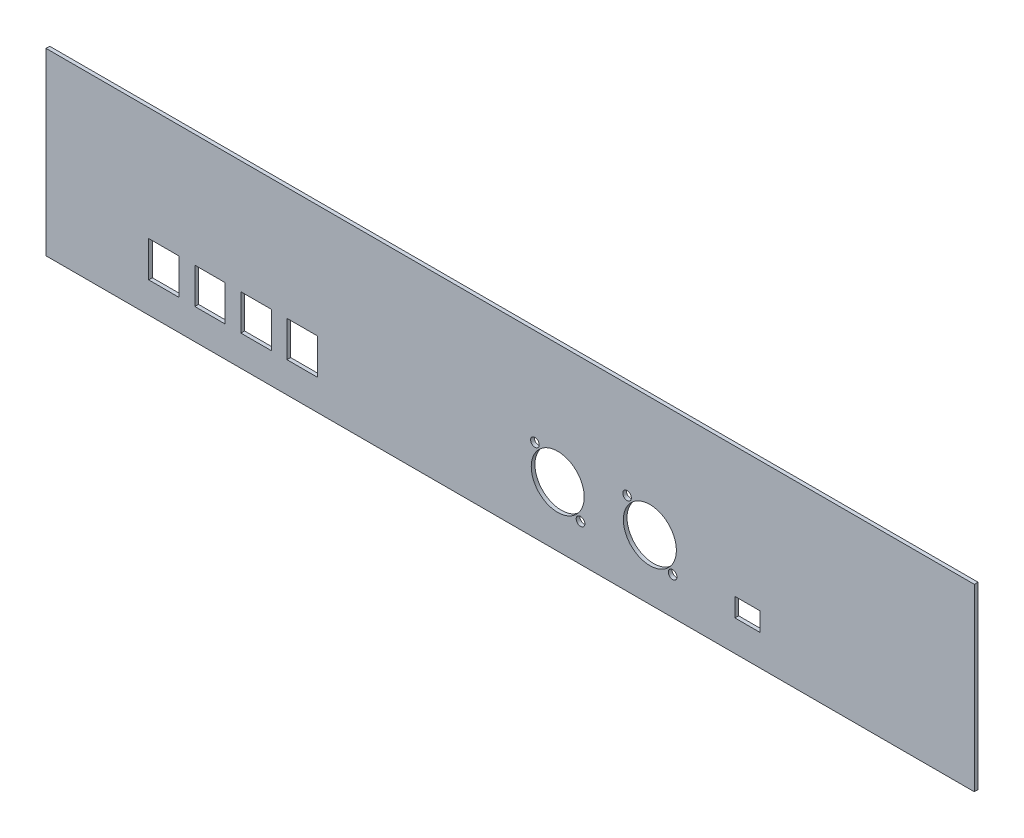
ISO-10303-21;
HEADER;
FILE_DESCRIPTION(('STEP AP214'),'2;1');
FILE_NAME('part.step','',(''),(''),'','','');
FILE_SCHEMA(('AUTOMOTIVE_DESIGN { 1 0 10303 214 1 1 1 1 }'));
ENDSEC;
DATA;
#1=APPLICATION_CONTEXT('core data for automotive mechanical design processes');
#2=APPLICATION_PROTOCOL_DEFINITION('international standard','automotive_design',2000,#1);
#3=PRODUCT_CONTEXT('',#1,'mechanical');
#4=PRODUCT('Part','Part','',(#3));
#5=PRODUCT_RELATED_PRODUCT_CATEGORY('part','',(#4));
#6=PRODUCT_DEFINITION_FORMATION('','',#4);
#7=PRODUCT_DEFINITION_CONTEXT('part definition',#1,'design');
#8=PRODUCT_DEFINITION('design','',#6,#7);
#9=PRODUCT_DEFINITION_SHAPE('','',#8);
#10=(LENGTH_UNIT() NAMED_UNIT(*) SI_UNIT(.MILLI.,.METRE.));
#11=(NAMED_UNIT(*) PLANE_ANGLE_UNIT() SI_UNIT($,.RADIAN.));
#12=(NAMED_UNIT(*) SI_UNIT($,.STERADIAN.) SOLID_ANGLE_UNIT());
#13=UNCERTAINTY_MEASURE_WITH_UNIT(LENGTH_MEASURE(1.E-05),#10,'distance_accuracy_value','');
#14=(GEOMETRIC_REPRESENTATION_CONTEXT(3) GLOBAL_UNCERTAINTY_ASSIGNED_CONTEXT((#13)) GLOBAL_UNIT_ASSIGNED_CONTEXT((#10,
#11,#12)) REPRESENTATION_CONTEXT('',''));
#15=CARTESIAN_POINT('',(0.,0.,0.));
#16=DIRECTION('',(0.,0.,1.));
#17=DIRECTION('',(1.,0.,0.));
#18=AXIS2_PLACEMENT_3D('',#15,#16,#17);
#19=CARTESIAN_POINT('',(0.,0.,1.6));
#20=DIRECTION('',(0.,0.,-1.));
#21=DIRECTION('',(-1.,0.,0.));
#22=AXIS2_PLACEMENT_3D('',#19,#20,#21);
#23=PLANE('',#22);
#24=DIRECTION('',(1.,0.,0.));
#25=VECTOR('',#24,1.);
#26=CARTESIAN_POINT('',(44.6,28.8,1.6));
#27=LINE('',#26,#25);
#28=CARTESIAN_POINT('',(44.6,28.8,1.6));
#29=VERTEX_POINT('',#28);
#30=CARTESIAN_POINT('',(57.8,28.8,1.6));
#31=VERTEX_POINT('',#30);
#32=EDGE_CURVE('E231',#29,#31,#27,.T.);
#33=ORIENTED_EDGE('',*,*,#32,.T.);
#34=DIRECTION('',(0.,-1.,0.));
#35=VECTOR('',#34,1.);
#36=CARTESIAN_POINT('',(57.8,28.8,1.6));
#37=LINE('',#36,#35);
#38=CARTESIAN_POINT('',(57.8,13.25,1.6));
#39=VERTEX_POINT('',#38);
#40=EDGE_CURVE('E227',#31,#39,#37,.T.);
#41=ORIENTED_EDGE('',*,*,#40,.T.);
#42=DIRECTION('',(-1.,0.,0.));
#43=VECTOR('',#42,1.);
#44=CARTESIAN_POINT('',(44.6,13.25,1.6));
#45=LINE('',#44,#43);
#46=CARTESIAN_POINT('',(44.6,13.25,1.6));
#47=VERTEX_POINT('',#46);
#48=EDGE_CURVE('E230',#39,#47,#45,.T.);
#49=ORIENTED_EDGE('',*,*,#48,.T.);
#50=DIRECTION('',(0.,1.,0.));
#51=VECTOR('',#50,1.);
#52=CARTESIAN_POINT('',(44.6,28.8,1.6));
#53=LINE('',#52,#51);
#54=EDGE_CURVE('E234',#47,#29,#53,.T.);
#55=ORIENTED_EDGE('',*,*,#54,.T.);
#56=EDGE_LOOP('',(#33,#41,#49,#55));
#57=FACE_BOUND('',#56,.T.);
#58=DIRECTION('',(1.,0.,0.));
#59=VECTOR('',#58,1.);
#60=CARTESIAN_POINT('',(84.6,28.8,1.6));
#61=LINE('',#60,#59);
#62=CARTESIAN_POINT('',(84.6,28.8,1.6));
#63=VERTEX_POINT('',#62);
#64=CARTESIAN_POINT('',(97.8,28.8,1.6));
#65=VERTEX_POINT('',#64);
#66=EDGE_CURVE('E299',#63,#65,#61,.T.);
#67=ORIENTED_EDGE('',*,*,#66,.T.);
#68=DIRECTION('',(0.,-1.,0.));
#69=VECTOR('',#68,1.);
#70=CARTESIAN_POINT('',(97.8,28.8,1.6));
#71=LINE('',#70,#69);
#72=CARTESIAN_POINT('',(97.8,13.25,1.6));
#73=VERTEX_POINT('',#72);
#74=EDGE_CURVE('E295',#65,#73,#71,.T.);
#75=ORIENTED_EDGE('',*,*,#74,.T.);
#76=DIRECTION('',(-1.,0.,0.));
#77=VECTOR('',#76,1.);
#78=CARTESIAN_POINT('',(84.6,13.25,1.6));
#79=LINE('',#78,#77);
#80=CARTESIAN_POINT('',(84.6,13.25,1.6));
#81=VERTEX_POINT('',#80);
#82=EDGE_CURVE('E298',#73,#81,#79,.T.);
#83=ORIENTED_EDGE('',*,*,#82,.T.);
#84=DIRECTION('',(0.,1.,0.));
#85=VECTOR('',#84,1.);
#86=CARTESIAN_POINT('',(84.6,28.8,1.6));
#87=LINE('',#86,#85);
#88=EDGE_CURVE('E275',#81,#63,#87,.T.);
#89=ORIENTED_EDGE('',*,*,#88,.T.);
#90=EDGE_LOOP('',(#67,#75,#83,#89));
#91=FACE_BOUND('',#90,.T.);
#92=DIRECTION('',(0.,-1.,0.));
#93=VECTOR('',#92,1.);
#94=CARTESIAN_POINT('',(0.,0.,1.6));
#95=LINE('',#94,#93);
#96=CARTESIAN_POINT('',(0.,78.,1.6));
#97=VERTEX_POINT('',#96);
#98=CARTESIAN_POINT('',(0.,0.,1.6));
#99=VERTEX_POINT('',#98);
#100=EDGE_CURVE('E397',#97,#99,#95,.T.);
#101=ORIENTED_EDGE('',*,*,#100,.T.);
#102=DIRECTION('',(1.,0.,0.));
#103=VECTOR('',#102,1.);
#104=CARTESIAN_POINT('',(0.,0.,1.6));
#105=LINE('',#104,#103);
#106=CARTESIAN_POINT('',(403.,0.,1.6));
#107=VERTEX_POINT('',#106);
#108=EDGE_CURVE('E400',#99,#107,#105,.T.);
#109=ORIENTED_EDGE('',*,*,#108,.T.);
#110=DIRECTION('',(0.,1.,0.));
#111=VECTOR('',#110,1.);
#112=CARTESIAN_POINT('',(403.,0.,1.6));
#113=LINE('',#112,#111);
#114=CARTESIAN_POINT('',(403.,78.,1.6));
#115=VERTEX_POINT('',#114);
#116=EDGE_CURVE('E403',#107,#115,#113,.T.);
#117=ORIENTED_EDGE('',*,*,#116,.T.);
#118=DIRECTION('',(-1.,0.,0.));
#119=VECTOR('',#118,1.);
#120=CARTESIAN_POINT('',(0.,78.,1.6));
#121=LINE('',#120,#119);
#122=EDGE_CURVE('E405',#115,#97,#121,.T.);
#123=ORIENTED_EDGE('',*,*,#122,.T.);
#124=EDGE_LOOP('',(#101,#109,#117,#123));
#125=FACE_BOUND('',#124,.T.);
#126=CARTESIAN_POINT('',(222.15,26.1,1.6));
#127=DIRECTION('',(0.,0.,-1.));
#128=DIRECTION('',(-1.,0.,0.));
#129=AXIS2_PLACEMENT_3D('',#126,#127,#128);
#130=CIRCLE('',#129,11.5);
#131=CARTESIAN_POINT('',(210.65,26.1,1.6));
#132=VERTEX_POINT('',#131);
#133=EDGE_CURVE('E393',#132,#132,#130,.T.);
#134=ORIENTED_EDGE('',*,*,#133,.T.);
#135=EDGE_LOOP('',(#134));
#136=FACE_BOUND('',#135,.T.);
#137=CARTESIAN_POINT('',(272.05,16.2,1.6));
#138=DIRECTION('',(0.,0.,-1.));
#139=DIRECTION('',(-1.,0.,0.));
#140=AXIS2_PLACEMENT_3D('',#137,#138,#139);
#141=CIRCLE('',#140,1.87499999999999);
#142=CARTESIAN_POINT('',(270.175,16.2,1.6));
#143=VERTEX_POINT('',#142);
#144=EDGE_CURVE('E363',#143,#143,#141,.T.);
#145=ORIENTED_EDGE('',*,*,#144,.T.);
#146=EDGE_LOOP('',(#145));
#147=FACE_BOUND('',#146,.T.);
#148=CARTESIAN_POINT('',(262.15,26.1,1.6));
#149=DIRECTION('',(0.,0.,-1.));
#150=DIRECTION('',(-1.,0.,0.));
#151=AXIS2_PLACEMENT_3D('',#148,#149,#150);
#152=CIRCLE('',#151,11.5);
#153=CARTESIAN_POINT('',(250.65,26.1,1.6));
#154=VERTEX_POINT('',#153);
#155=EDGE_CURVE('E378',#154,#154,#152,.T.);
#156=ORIENTED_EDGE('',*,*,#155,.T.);
#157=EDGE_LOOP('',(#156));
#158=FACE_BOUND('',#157,.T.);
#159=CARTESIAN_POINT('',(252.25,36.,1.6));
#160=DIRECTION('',(0.,0.,-1.));
#161=DIRECTION('',(-1.,0.,0.));
#162=AXIS2_PLACEMENT_3D('',#159,#160,#161);
#163=CIRCLE('',#162,1.87499999999999);
#164=CARTESIAN_POINT('',(250.375,36.,1.6));
#165=VERTEX_POINT('',#164);
#166=EDGE_CURVE('E383',#165,#165,#163,.T.);
#167=ORIENTED_EDGE('',*,*,#166,.T.);
#168=EDGE_LOOP('',(#167));
#169=FACE_BOUND('',#168,.T.);
#170=CARTESIAN_POINT('',(232.05,16.2,1.6));
#171=DIRECTION('',(0.,0.,-1.));
#172=DIRECTION('',(-1.,0.,0.));
#173=AXIS2_PLACEMENT_3D('',#170,#171,#172);
#174=CIRCLE('',#173,1.87499999999999);
#175=CARTESIAN_POINT('',(230.175,16.2,1.6));
#176=VERTEX_POINT('',#175);
#177=EDGE_CURVE('E371',#176,#176,#174,.T.);
#178=ORIENTED_EDGE('',*,*,#177,.T.);
#179=EDGE_LOOP('',(#178));
#180=FACE_BOUND('',#179,.T.);
#181=CARTESIAN_POINT('',(212.25,36.,1.6));
#182=DIRECTION('',(0.,0.,-1.));
#183=DIRECTION('',(-1.,0.,0.));
#184=AXIS2_PLACEMENT_3D('',#181,#182,#183);
#185=CIRCLE('',#184,1.87499999999999);
#186=CARTESIAN_POINT('',(210.375,36.,1.6));
#187=VERTEX_POINT('',#186);
#188=EDGE_CURVE('E370',#187,#187,#185,.T.);
#189=ORIENTED_EDGE('',*,*,#188,.T.);
#190=EDGE_LOOP('',(#189));
#191=FACE_BOUND('',#190,.T.);
#192=DIRECTION('',(1.,0.,0.));
#193=VECTOR('',#192,1.);
#194=CARTESIAN_POINT('',(104.6,28.8,1.6));
#195=LINE('',#194,#193);
#196=CARTESIAN_POINT('',(104.6,28.8,1.6));
#197=VERTEX_POINT('',#196);
#198=CARTESIAN_POINT('',(117.8,28.8,1.6));
#199=VERTEX_POINT('',#198);
#200=EDGE_CURVE('E332',#197,#199,#195,.T.);
#201=ORIENTED_EDGE('',*,*,#200,.T.);
#202=DIRECTION('',(0.,-1.,0.));
#203=VECTOR('',#202,1.);
#204=CARTESIAN_POINT('',(117.8,28.8,1.6));
#205=LINE('',#204,#203);
#206=CARTESIAN_POINT('',(117.8,13.25,1.6));
#207=VERTEX_POINT('',#206);
#208=EDGE_CURVE('E328',#199,#207,#205,.T.);
#209=ORIENTED_EDGE('',*,*,#208,.T.);
#210=DIRECTION('',(-1.,0.,0.));
#211=VECTOR('',#210,1.);
#212=CARTESIAN_POINT('',(104.6,13.25,1.6));
#213=LINE('',#212,#211);
#214=CARTESIAN_POINT('',(104.6,13.25,1.6));
#215=VERTEX_POINT('',#214);
#216=EDGE_CURVE('E331',#207,#215,#213,.T.);
#217=ORIENTED_EDGE('',*,*,#216,.T.);
#218=DIRECTION('',(0.,1.,0.));
#219=VECTOR('',#218,1.);
#220=CARTESIAN_POINT('',(104.6,28.8,1.6));
#221=LINE('',#220,#219);
#222=EDGE_CURVE('E308',#215,#197,#221,.T.);
#223=ORIENTED_EDGE('',*,*,#222,.T.);
#224=EDGE_LOOP('',(#201,#209,#217,#223));
#225=FACE_BOUND('',#224,.T.);
#226=DIRECTION('',(1.,0.,0.));
#227=VECTOR('',#226,1.);
#228=CARTESIAN_POINT('',(64.6,28.8,1.6));
#229=LINE('',#228,#227);
#230=CARTESIAN_POINT('',(64.6,28.8,1.6));
#231=VERTEX_POINT('',#230);
#232=CARTESIAN_POINT('',(77.8,28.8,1.6));
#233=VERTEX_POINT('',#232);
#234=EDGE_CURVE('E266',#231,#233,#229,.T.);
#235=ORIENTED_EDGE('',*,*,#234,.T.);
#236=DIRECTION('',(0.,-1.,0.));
#237=VECTOR('',#236,1.);
#238=CARTESIAN_POINT('',(77.8,28.8,1.6));
#239=LINE('',#238,#237);
#240=CARTESIAN_POINT('',(77.8,13.25,1.6));
#241=VERTEX_POINT('',#240);
#242=EDGE_CURVE('E262',#233,#241,#239,.T.);
#243=ORIENTED_EDGE('',*,*,#242,.T.);
#244=DIRECTION('',(-1.,0.,0.));
#245=VECTOR('',#244,1.);
#246=CARTESIAN_POINT('',(64.6,13.25,1.6));
#247=LINE('',#246,#245);
#248=CARTESIAN_POINT('',(64.6,13.25,1.6));
#249=VERTEX_POINT('',#248);
#250=EDGE_CURVE('E265',#241,#249,#247,.T.);
#251=ORIENTED_EDGE('',*,*,#250,.T.);
#252=DIRECTION('',(0.,1.,0.));
#253=VECTOR('',#252,1.);
#254=CARTESIAN_POINT('',(64.6,28.8,1.6));
#255=LINE('',#254,#253);
#256=EDGE_CURVE('E242',#249,#231,#255,.T.);
#257=ORIENTED_EDGE('',*,*,#256,.T.);
#258=EDGE_LOOP('',(#235,#243,#251,#257));
#259=FACE_BOUND('',#258,.T.);
#260=DIRECTION('',(1.,0.,0.));
#261=VECTOR('',#260,1.);
#262=CARTESIAN_POINT('',(299.1,21.5,1.6));
#263=LINE('',#262,#261);
#264=CARTESIAN_POINT('',(299.1,21.5,1.6));
#265=VERTEX_POINT('',#264);
#266=CARTESIAN_POINT('',(309.95,21.5,1.6));
#267=VERTEX_POINT('',#266);
#268=EDGE_CURVE('E223',#265,#267,#263,.T.);
#269=ORIENTED_EDGE('',*,*,#268,.T.);
#270=DIRECTION('',(0.,-1.,0.));
#271=VECTOR('',#270,1.);
#272=CARTESIAN_POINT('',(309.95,21.5,1.6));
#273=LINE('',#272,#271);
#274=CARTESIAN_POINT('',(309.95,13.4,1.6));
#275=VERTEX_POINT('',#274);
#276=EDGE_CURVE('E226',#267,#275,#273,.T.);
#277=ORIENTED_EDGE('',*,*,#276,.T.);
#278=DIRECTION('',(-1.,0.,0.));
#279=VECTOR('',#278,1.);
#280=CARTESIAN_POINT('',(299.1,13.4,1.6));
#281=LINE('',#280,#279);
#282=CARTESIAN_POINT('',(299.1,13.4,1.6));
#283=VERTEX_POINT('',#282);
#284=EDGE_CURVE('E197',#275,#283,#281,.T.);
#285=ORIENTED_EDGE('',*,*,#284,.T.);
#286=DIRECTION('',(0.,1.,0.));
#287=VECTOR('',#286,1.);
#288=CARTESIAN_POINT('',(299.1,21.5,1.6));
#289=LINE('',#288,#287);
#290=EDGE_CURVE('E341',#283,#265,#289,.T.);
#291=ORIENTED_EDGE('',*,*,#290,.T.);
#292=EDGE_LOOP('',(#269,#277,#285,#291));
#293=FACE_BOUND('',#292,.T.);
#294=ADVANCED_FACE('F33',(#57,#91,#125,#136,#147,#158,#169,#180,#191,#225,#259,#293),#23,.F.);
#295=CARTESIAN_POINT('',(0.,0.,0.));
#296=DIRECTION('',(0.,0.,-1.));
#297=DIRECTION('',(-1.,0.,0.));
#298=AXIS2_PLACEMENT_3D('',#295,#296,#297);
#299=PLANE('',#298);
#300=CARTESIAN_POINT('',(212.25,36.,0.));
#301=DIRECTION('',(0.,0.,1.));
#302=DIRECTION('',(1.,0.,0.));
#303=AXIS2_PLACEMENT_3D('',#300,#301,#302);
#304=CIRCLE('',#303,1.87499999999999);
#305=CARTESIAN_POINT('',(214.125,36.,0.));
#306=VERTEX_POINT('',#305);
#307=EDGE_CURVE('E367',#306,#306,#304,.T.);
#308=ORIENTED_EDGE('',*,*,#307,.T.);
#309=EDGE_LOOP('',(#308));
#310=FACE_BOUND('',#309,.T.);
#311=CARTESIAN_POINT('',(232.05,16.2,0.));
#312=DIRECTION('',(0.,0.,1.));
#313=DIRECTION('',(1.,0.,0.));
#314=AXIS2_PLACEMENT_3D('',#311,#312,#313);
#315=CIRCLE('',#314,1.87499999999999);
#316=CARTESIAN_POINT('',(233.925,16.2,0.));
#317=VERTEX_POINT('',#316);
#318=EDGE_CURVE('E375',#317,#317,#315,.T.);
#319=ORIENTED_EDGE('',*,*,#318,.T.);
#320=EDGE_LOOP('',(#319));
#321=FACE_BOUND('',#320,.T.);
#322=CARTESIAN_POINT('',(252.25,36.,0.));
#323=DIRECTION('',(0.,0.,1.));
#324=DIRECTION('',(1.,0.,0.));
#325=AXIS2_PLACEMENT_3D('',#322,#323,#324);
#326=CIRCLE('',#325,1.87499999999999);
#327=CARTESIAN_POINT('',(254.125,36.,0.));
#328=VERTEX_POINT('',#327);
#329=EDGE_CURVE('E366',#328,#328,#326,.T.);
#330=ORIENTED_EDGE('',*,*,#329,.T.);
#331=EDGE_LOOP('',(#330));
#332=FACE_BOUND('',#331,.T.);
#333=CARTESIAN_POINT('',(262.15,26.1,0.));
#334=DIRECTION('',(0.,0.,1.));
#335=DIRECTION('',(1.,0.,0.));
#336=AXIS2_PLACEMENT_3D('',#333,#334,#335);
#337=CIRCLE('',#336,11.5);
#338=CARTESIAN_POINT('',(273.65,26.1,0.));
#339=VERTEX_POINT('',#338);
#340=EDGE_CURVE('E386',#339,#339,#337,.T.);
#341=ORIENTED_EDGE('',*,*,#340,.T.);
#342=EDGE_LOOP('',(#341));
#343=FACE_BOUND('',#342,.T.);
#344=CARTESIAN_POINT('',(272.05,16.2,0.));
#345=DIRECTION('',(0.,0.,1.));
#346=DIRECTION('',(1.,0.,0.));
#347=AXIS2_PLACEMENT_3D('',#344,#345,#346);
#348=CIRCLE('',#347,1.87499999999999);
#349=CARTESIAN_POINT('',(273.925,16.2,0.));
#350=VERTEX_POINT('',#349);
#351=EDGE_CURVE('E237',#350,#350,#348,.T.);
#352=ORIENTED_EDGE('',*,*,#351,.T.);
#353=EDGE_LOOP('',(#352));
#354=FACE_BOUND('',#353,.T.);
#355=CARTESIAN_POINT('',(222.15,26.1,0.));
#356=DIRECTION('',(0.,0.,1.));
#357=DIRECTION('',(1.,0.,0.));
#358=AXIS2_PLACEMENT_3D('',#355,#356,#357);
#359=CIRCLE('',#358,11.5);
#360=CARTESIAN_POINT('',(233.65,26.1,0.));
#361=VERTEX_POINT('',#360);
#362=EDGE_CURVE('E374',#361,#361,#359,.T.);
#363=ORIENTED_EDGE('',*,*,#362,.T.);
#364=EDGE_LOOP('',(#363));
#365=FACE_BOUND('',#364,.T.);
#366=DIRECTION('',(0.,-1.,0.));
#367=VECTOR('',#366,1.);
#368=CARTESIAN_POINT('',(0.,0.,0.));
#369=LINE('',#368,#367);
#370=CARTESIAN_POINT('',(0.,78.,0.));
#371=VERTEX_POINT('',#370);
#372=CARTESIAN_POINT('',(0.,0.,0.));
#373=VERTEX_POINT('',#372);
#374=EDGE_CURVE('E396',#371,#373,#369,.T.);
#375=ORIENTED_EDGE('',*,*,#374,.F.);
#376=DIRECTION('',(-1.,0.,0.));
#377=VECTOR('',#376,1.);
#378=CARTESIAN_POINT('',(0.,78.,0.));
#379=LINE('',#378,#377);
#380=CARTESIAN_POINT('',(403.,78.,0.));
#381=VERTEX_POINT('',#380);
#382=EDGE_CURVE('E401',#381,#371,#379,.T.);
#383=ORIENTED_EDGE('',*,*,#382,.F.);
#384=DIRECTION('',(0.,1.,0.));
#385=VECTOR('',#384,1.);
#386=CARTESIAN_POINT('',(403.,0.,0.));
#387=LINE('',#386,#385);
#388=CARTESIAN_POINT('',(403.,0.,0.));
#389=VERTEX_POINT('',#388);
#390=EDGE_CURVE('E412',#389,#381,#387,.T.);
#391=ORIENTED_EDGE('',*,*,#390,.F.);
#392=DIRECTION('',(1.,0.,0.));
#393=VECTOR('',#392,1.);
#394=CARTESIAN_POINT('',(0.,0.,0.));
#395=LINE('',#394,#393);
#396=EDGE_CURVE('E410',#373,#389,#395,.T.);
#397=ORIENTED_EDGE('',*,*,#396,.F.);
#398=EDGE_LOOP('',(#375,#383,#391,#397));
#399=FACE_BOUND('',#398,.T.);
#400=DIRECTION('',(0.,1.,0.));
#401=VECTOR('',#400,1.);
#402=CARTESIAN_POINT('',(117.8,28.8,0.));
#403=LINE('',#402,#401);
#404=CARTESIAN_POINT('',(117.8,13.25,0.));
#405=VERTEX_POINT('',#404);
#406=CARTESIAN_POINT('',(117.8,28.8,0.));
#407=VERTEX_POINT('',#406);
#408=EDGE_CURVE('E344',#405,#407,#403,.T.);
#409=ORIENTED_EDGE('',*,*,#408,.T.);
#410=DIRECTION('',(-1.,0.,0.));
#411=VECTOR('',#410,1.);
#412=CARTESIAN_POINT('',(104.6,28.8,0.));
#413=LINE('',#412,#411);
#414=CARTESIAN_POINT('',(104.6,28.8,0.));
#415=VERTEX_POINT('',#414);
#416=EDGE_CURVE('E347',#407,#415,#413,.T.);
#417=ORIENTED_EDGE('',*,*,#416,.T.);
#418=DIRECTION('',(0.,-1.,0.));
#419=VECTOR('',#418,1.);
#420=CARTESIAN_POINT('',(104.6,28.8,0.));
#421=LINE('',#420,#419);
#422=CARTESIAN_POINT('',(104.6,13.25,0.));
#423=VERTEX_POINT('',#422);
#424=EDGE_CURVE('E337',#415,#423,#421,.T.);
#425=ORIENTED_EDGE('',*,*,#424,.T.);
#426=DIRECTION('',(1.,0.,0.));
#427=VECTOR('',#426,1.);
#428=CARTESIAN_POINT('',(104.6,13.25,0.));
#429=LINE('',#428,#427);
#430=EDGE_CURVE('E340',#423,#405,#429,.T.);
#431=ORIENTED_EDGE('',*,*,#430,.T.);
#432=EDGE_LOOP('',(#409,#417,#425,#431));
#433=FACE_BOUND('',#432,.T.);
#434=DIRECTION('',(0.,1.,0.));
#435=VECTOR('',#434,1.);
#436=CARTESIAN_POINT('',(97.8,28.8,0.));
#437=LINE('',#436,#435);
#438=CARTESIAN_POINT('',(97.8,13.25,0.));
#439=VERTEX_POINT('',#438);
#440=CARTESIAN_POINT('',(97.8,28.8,0.));
#441=VERTEX_POINT('',#440);
#442=EDGE_CURVE('E311',#439,#441,#437,.T.);
#443=ORIENTED_EDGE('',*,*,#442,.T.);
#444=DIRECTION('',(-1.,0.,0.));
#445=VECTOR('',#444,1.);
#446=CARTESIAN_POINT('',(84.6,28.8,0.));
#447=LINE('',#446,#445);
#448=CARTESIAN_POINT('',(84.6,28.8,0.));
#449=VERTEX_POINT('',#448);
#450=EDGE_CURVE('E314',#441,#449,#447,.T.);
#451=ORIENTED_EDGE('',*,*,#450,.T.);
#452=DIRECTION('',(0.,-1.,0.));
#453=VECTOR('',#452,1.);
#454=CARTESIAN_POINT('',(84.6,28.8,0.));
#455=LINE('',#454,#453);
#456=CARTESIAN_POINT('',(84.6,13.25,0.));
#457=VERTEX_POINT('',#456);
#458=EDGE_CURVE('E304',#449,#457,#455,.T.);
#459=ORIENTED_EDGE('',*,*,#458,.T.);
#460=DIRECTION('',(1.,0.,0.));
#461=VECTOR('',#460,1.);
#462=CARTESIAN_POINT('',(84.6,13.25,0.));
#463=LINE('',#462,#461);
#464=EDGE_CURVE('E307',#457,#439,#463,.T.);
#465=ORIENTED_EDGE('',*,*,#464,.T.);
#466=EDGE_LOOP('',(#443,#451,#459,#465));
#467=FACE_BOUND('',#466,.T.);
#468=DIRECTION('',(0.,1.,0.));
#469=VECTOR('',#468,1.);
#470=CARTESIAN_POINT('',(77.8,28.8,0.));
#471=LINE('',#470,#469);
#472=CARTESIAN_POINT('',(77.8,13.25,0.));
#473=VERTEX_POINT('',#472);
#474=CARTESIAN_POINT('',(77.8,28.8,0.));
#475=VERTEX_POINT('',#474);
#476=EDGE_CURVE('E278',#473,#475,#471,.T.);
#477=ORIENTED_EDGE('',*,*,#476,.T.);
#478=DIRECTION('',(-1.,0.,0.));
#479=VECTOR('',#478,1.);
#480=CARTESIAN_POINT('',(64.6,28.8,0.));
#481=LINE('',#480,#479);
#482=CARTESIAN_POINT('',(64.6,28.8,0.));
#483=VERTEX_POINT('',#482);
#484=EDGE_CURVE('E281',#475,#483,#481,.T.);
#485=ORIENTED_EDGE('',*,*,#484,.T.);
#486=DIRECTION('',(0.,-1.,0.));
#487=VECTOR('',#486,1.);
#488=CARTESIAN_POINT('',(64.6,28.8,0.));
#489=LINE('',#488,#487);
#490=CARTESIAN_POINT('',(64.6,13.25,0.));
#491=VERTEX_POINT('',#490);
#492=EDGE_CURVE('E271',#483,#491,#489,.T.);
#493=ORIENTED_EDGE('',*,*,#492,.T.);
#494=DIRECTION('',(1.,0.,0.));
#495=VECTOR('',#494,1.);
#496=CARTESIAN_POINT('',(64.6,13.25,0.));
#497=LINE('',#496,#495);
#498=EDGE_CURVE('E274',#491,#473,#497,.T.);
#499=ORIENTED_EDGE('',*,*,#498,.T.);
#500=EDGE_LOOP('',(#477,#485,#493,#499));
#501=FACE_BOUND('',#500,.T.);
#502=DIRECTION('',(0.,1.,0.));
#503=VECTOR('',#502,1.);
#504=CARTESIAN_POINT('',(57.8,28.8,0.));
#505=LINE('',#504,#503);
#506=CARTESIAN_POINT('',(57.8,13.25,0.));
#507=VERTEX_POINT('',#506);
#508=CARTESIAN_POINT('',(57.8,28.8,0.));
#509=VERTEX_POINT('',#508);
#510=EDGE_CURVE('E245',#507,#509,#505,.T.);
#511=ORIENTED_EDGE('',*,*,#510,.T.);
#512=DIRECTION('',(-1.,0.,0.));
#513=VECTOR('',#512,1.);
#514=CARTESIAN_POINT('',(44.6,28.8,0.));
#515=LINE('',#514,#513);
#516=CARTESIAN_POINT('',(44.6,28.8,0.));
#517=VERTEX_POINT('',#516);
#518=EDGE_CURVE('E248',#509,#517,#515,.T.);
#519=ORIENTED_EDGE('',*,*,#518,.T.);
#520=DIRECTION('',(0.,-1.,0.));
#521=VECTOR('',#520,1.);
#522=CARTESIAN_POINT('',(44.6,28.8,0.));
#523=LINE('',#522,#521);
#524=CARTESIAN_POINT('',(44.6,13.25,0.));
#525=VERTEX_POINT('',#524);
#526=EDGE_CURVE('E238',#517,#525,#523,.T.);
#527=ORIENTED_EDGE('',*,*,#526,.T.);
#528=DIRECTION('',(1.,0.,0.));
#529=VECTOR('',#528,1.);
#530=CARTESIAN_POINT('',(44.6,13.25,0.));
#531=LINE('',#530,#529);
#532=EDGE_CURVE('E241',#525,#507,#531,.T.);
#533=ORIENTED_EDGE('',*,*,#532,.T.);
#534=EDGE_LOOP('',(#511,#519,#527,#533));
#535=FACE_BOUND('',#534,.T.);
#536=DIRECTION('',(0.,1.,0.));
#537=VECTOR('',#536,1.);
#538=CARTESIAN_POINT('',(309.95,21.5,0.));
#539=LINE('',#538,#537);
#540=CARTESIAN_POINT('',(309.95,13.4,0.));
#541=VERTEX_POINT('',#540);
#542=CARTESIAN_POINT('',(309.95,21.5,0.));
#543=VERTEX_POINT('',#542);
#544=EDGE_CURVE('E204',#541,#543,#539,.T.);
#545=ORIENTED_EDGE('',*,*,#544,.T.);
#546=DIRECTION('',(-1.,0.,0.));
#547=VECTOR('',#546,1.);
#548=CARTESIAN_POINT('',(299.1,21.5,0.));
#549=LINE('',#548,#547);
#550=CARTESIAN_POINT('',(299.1,21.5,0.));
#551=VERTEX_POINT('',#550);
#552=EDGE_CURVE('E210',#543,#551,#549,.T.);
#553=ORIENTED_EDGE('',*,*,#552,.T.);
#554=DIRECTION('',(0.,-1.,0.));
#555=VECTOR('',#554,1.);
#556=CARTESIAN_POINT('',(299.1,21.5,0.));
#557=LINE('',#556,#555);
#558=CARTESIAN_POINT('',(299.1,13.4,0.));
#559=VERTEX_POINT('',#558);
#560=EDGE_CURVE('E214',#551,#559,#557,.T.);
#561=ORIENTED_EDGE('',*,*,#560,.T.);
#562=DIRECTION('',(1.,0.,0.));
#563=VECTOR('',#562,1.);
#564=CARTESIAN_POINT('',(299.1,13.4,0.));
#565=LINE('',#564,#563);
#566=EDGE_CURVE('E56',#559,#541,#565,.T.);
#567=ORIENTED_EDGE('',*,*,#566,.T.);
#568=EDGE_LOOP('',(#545,#553,#561,#567));
#569=FACE_BOUND('',#568,.T.);
#570=ADVANCED_FACE('F213',(#310,#321,#332,#343,#354,#365,#399,#433,#467,#501,#535,#569),#299,.T.);
#571=CARTESIAN_POINT('',(0.,0.,1.6));
#572=DIRECTION('',(1.,0.,0.));
#573=DIRECTION('',(0.,0.,-1.));
#574=AXIS2_PLACEMENT_3D('',#571,#572,#573);
#575=PLANE('',#574);
#576=ORIENTED_EDGE('',*,*,#374,.T.);
#577=DIRECTION('',(0.,0.,-1.));
#578=VECTOR('',#577,1.);
#579=CARTESIAN_POINT('',(0.,0.,1.6));
#580=LINE('',#579,#578);
#581=EDGE_CURVE('E11',#99,#373,#580,.T.);
#582=ORIENTED_EDGE('',*,*,#581,.F.);
#583=ORIENTED_EDGE('',*,*,#100,.F.);
#584=DIRECTION('',(0.,0.,-1.));
#585=VECTOR('',#584,1.);
#586=CARTESIAN_POINT('',(0.,78.,1.6));
#587=LINE('',#586,#585);
#588=EDGE_CURVE('E407',#97,#371,#587,.T.);
#589=ORIENTED_EDGE('',*,*,#588,.T.);
#590=EDGE_LOOP('',(#576,#582,#583,#589));
#591=FACE_BOUND('',#590,.T.);
#592=ADVANCED_FACE('F35',(#591),#575,.F.);
#593=CARTESIAN_POINT('',(0.,0.,1.6));
#594=DIRECTION('',(0.,1.,0.));
#595=DIRECTION('',(0.,0.,1.));
#596=AXIS2_PLACEMENT_3D('',#593,#594,#595);
#597=PLANE('',#596);
#598=ORIENTED_EDGE('',*,*,#396,.T.);
#599=DIRECTION('',(0.,0.,-1.));
#600=VECTOR('',#599,1.);
#601=CARTESIAN_POINT('',(403.,0.,1.6));
#602=LINE('',#601,#600);
#603=EDGE_CURVE('E41',#107,#389,#602,.T.);
#604=ORIENTED_EDGE('',*,*,#603,.F.);
#605=ORIENTED_EDGE('',*,*,#108,.F.);
#606=ORIENTED_EDGE('',*,*,#581,.T.);
#607=EDGE_LOOP('',(#598,#604,#605,#606));
#608=FACE_BOUND('',#607,.T.);
#609=ADVANCED_FACE('F440',(#608),#597,.F.);
#610=CARTESIAN_POINT('',(403.,0.,1.6));
#611=DIRECTION('',(-1.,0.,0.));
#612=DIRECTION('',(0.,0.,1.));
#613=AXIS2_PLACEMENT_3D('',#610,#611,#612);
#614=PLANE('',#613);
#615=ORIENTED_EDGE('',*,*,#390,.T.);
#616=DIRECTION('',(0.,0.,-1.));
#617=VECTOR('',#616,1.);
#618=CARTESIAN_POINT('',(403.,78.,1.6));
#619=LINE('',#618,#617);
#620=EDGE_CURVE('E417',#115,#381,#619,.T.);
#621=ORIENTED_EDGE('',*,*,#620,.F.);
#622=ORIENTED_EDGE('',*,*,#116,.F.);
#623=ORIENTED_EDGE('',*,*,#603,.T.);
#624=EDGE_LOOP('',(#615,#621,#622,#623));
#625=FACE_BOUND('',#624,.T.);
#626=ADVANCED_FACE('F424',(#625),#614,.F.);
#627=CARTESIAN_POINT('',(0.,78.,1.6));
#628=DIRECTION('',(0.,-1.,0.));
#629=DIRECTION('',(0.,0.,-1.));
#630=AXIS2_PLACEMENT_3D('',#627,#628,#629);
#631=PLANE('',#630);
#632=ORIENTED_EDGE('',*,*,#382,.T.);
#633=ORIENTED_EDGE('',*,*,#588,.F.);
#634=ORIENTED_EDGE('',*,*,#122,.F.);
#635=ORIENTED_EDGE('',*,*,#620,.T.);
#636=EDGE_LOOP('',(#632,#633,#634,#635));
#637=FACE_BOUND('',#636,.T.);
#638=ADVANCED_FACE('F433',(#637),#631,.F.);
#639=CARTESIAN_POINT('',(222.15,26.1,34.1269119345812));
#640=DIRECTION('',(0.,0.,-1.));
#641=DIRECTION('',(-1.,0.,0.));
#642=AXIS2_PLACEMENT_3D('',#639,#640,#641);
#643=CYLINDRICAL_SURFACE('',#642,11.5);
#644=ORIENTED_EDGE('',*,*,#133,.F.);
#645=EDGE_LOOP('',(#644));
#646=FACE_BOUND('',#645,.T.);
#647=ORIENTED_EDGE('',*,*,#362,.F.);
#648=EDGE_LOOP('',(#647));
#649=FACE_BOUND('',#648,.T.);
#650=ADVANCED_FACE('F457',(#646,#649),#643,.F.);
#651=CARTESIAN_POINT('',(272.05,16.2,34.1269119345812));
#652=DIRECTION('',(0.,0.,-1.));
#653=DIRECTION('',(-1.,0.,0.));
#654=AXIS2_PLACEMENT_3D('',#651,#652,#653);
#655=CYLINDRICAL_SURFACE('',#654,1.87499999999999);
#656=ORIENTED_EDGE('',*,*,#144,.F.);
#657=EDGE_LOOP('',(#656));
#658=FACE_BOUND('',#657,.T.);
#659=ORIENTED_EDGE('',*,*,#351,.F.);
#660=EDGE_LOOP('',(#659));
#661=FACE_BOUND('',#660,.T.);
#662=ADVANCED_FACE('F464',(#658,#661),#655,.F.);
#663=CARTESIAN_POINT('',(262.15,26.1,34.1269119345812));
#664=DIRECTION('',(0.,0.,-1.));
#665=DIRECTION('',(-1.,0.,0.));
#666=AXIS2_PLACEMENT_3D('',#663,#664,#665);
#667=CYLINDRICAL_SURFACE('',#666,11.5);
#668=ORIENTED_EDGE('',*,*,#155,.F.);
#669=EDGE_LOOP('',(#668));
#670=FACE_BOUND('',#669,.T.);
#671=ORIENTED_EDGE('',*,*,#340,.F.);
#672=EDGE_LOOP('',(#671));
#673=FACE_BOUND('',#672,.T.);
#674=ADVANCED_FACE('F469',(#670,#673),#667,.F.);
#675=CARTESIAN_POINT('',(252.25,36.,34.1269119345812));
#676=DIRECTION('',(0.,0.,-1.));
#677=DIRECTION('',(-1.,0.,0.));
#678=AXIS2_PLACEMENT_3D('',#675,#676,#677);
#679=CYLINDRICAL_SURFACE('',#678,1.87499999999999);
#680=ORIENTED_EDGE('',*,*,#166,.F.);
#681=EDGE_LOOP('',(#680));
#682=FACE_BOUND('',#681,.T.);
#683=ORIENTED_EDGE('',*,*,#329,.F.);
#684=EDGE_LOOP('',(#683));
#685=FACE_BOUND('',#684,.T.);
#686=ADVANCED_FACE('F576',(#682,#685),#679,.F.);
#687=CARTESIAN_POINT('',(232.05,16.2,34.1269119345812));
#688=DIRECTION('',(0.,0.,-1.));
#689=DIRECTION('',(-1.,0.,0.));
#690=AXIS2_PLACEMENT_3D('',#687,#688,#689);
#691=CYLINDRICAL_SURFACE('',#690,1.87499999999999);
#692=ORIENTED_EDGE('',*,*,#177,.F.);
#693=EDGE_LOOP('',(#692));
#694=FACE_BOUND('',#693,.T.);
#695=ORIENTED_EDGE('',*,*,#318,.F.);
#696=EDGE_LOOP('',(#695));
#697=FACE_BOUND('',#696,.T.);
#698=ADVANCED_FACE('F572',(#694,#697),#691,.F.);
#699=CARTESIAN_POINT('',(212.25,36.,34.1269119345812));
#700=DIRECTION('',(0.,0.,-1.));
#701=DIRECTION('',(-1.,0.,0.));
#702=AXIS2_PLACEMENT_3D('',#699,#700,#701);
#703=CYLINDRICAL_SURFACE('',#702,1.87499999999999);
#704=ORIENTED_EDGE('',*,*,#188,.F.);
#705=EDGE_LOOP('',(#704));
#706=FACE_BOUND('',#705,.T.);
#707=ORIENTED_EDGE('',*,*,#307,.F.);
#708=EDGE_LOOP('',(#707));
#709=FACE_BOUND('',#708,.T.);
#710=ADVANCED_FACE('F558',(#706,#709),#703,.F.);
#711=CARTESIAN_POINT('',(104.6,28.8,21.9971198947303));
#712=DIRECTION('',(0.,-1.,0.));
#713=DIRECTION('',(1.,0.,0.));
#714=AXIS2_PLACEMENT_3D('',#711,#712,#713);
#715=PLANE('',#714);
#716=DIRECTION('',(0.,0.,-1.));
#717=VECTOR('',#716,1.);
#718=CARTESIAN_POINT('',(104.6,28.8,21.9971198947303));
#719=LINE('',#718,#717);
#720=EDGE_CURVE('E350',#197,#415,#719,.T.);
#721=ORIENTED_EDGE('',*,*,#720,.T.);
#722=ORIENTED_EDGE('',*,*,#416,.F.);
#723=DIRECTION('',(0.,0.,-1.));
#724=VECTOR('',#723,1.);
#725=CARTESIAN_POINT('',(117.8,28.8,21.9971198947303));
#726=LINE('',#725,#724);
#727=EDGE_CURVE('E352',#199,#407,#726,.T.);
#728=ORIENTED_EDGE('',*,*,#727,.F.);
#729=ORIENTED_EDGE('',*,*,#200,.F.);
#730=EDGE_LOOP('',(#721,#722,#728,#729));
#731=FACE_BOUND('',#730,.T.);
#732=ADVANCED_FACE('F554',(#731),#715,.T.);
#733=CARTESIAN_POINT('',(117.8,28.8,21.9971198947303));
#734=DIRECTION('',(-1.,0.,0.));
#735=DIRECTION('',(0.,0.,1.));
#736=AXIS2_PLACEMENT_3D('',#733,#734,#735);
#737=PLANE('',#736);
#738=ORIENTED_EDGE('',*,*,#727,.T.);
#739=ORIENTED_EDGE('',*,*,#408,.F.);
#740=DIRECTION('',(0.,0.,-1.));
#741=VECTOR('',#740,1.);
#742=CARTESIAN_POINT('',(117.8,13.25,21.9971198947303));
#743=LINE('',#742,#741);
#744=EDGE_CURVE('E354',#207,#405,#743,.T.);
#745=ORIENTED_EDGE('',*,*,#744,.F.);
#746=ORIENTED_EDGE('',*,*,#208,.F.);
#747=EDGE_LOOP('',(#738,#739,#745,#746));
#748=FACE_BOUND('',#747,.T.);
#749=ADVANCED_FACE('F557',(#748),#737,.T.);
#750=CARTESIAN_POINT('',(104.6,13.25,21.9971198947303));
#751=DIRECTION('',(0.,1.,0.));
#752=DIRECTION('',(0.,0.,1.));
#753=AXIS2_PLACEMENT_3D('',#750,#751,#752);
#754=PLANE('',#753);
#755=ORIENTED_EDGE('',*,*,#744,.T.);
#756=ORIENTED_EDGE('',*,*,#430,.F.);
#757=DIRECTION('',(0.,0.,-1.));
#758=VECTOR('',#757,1.);
#759=CARTESIAN_POINT('',(104.6,13.25,21.9971198947303));
#760=LINE('',#759,#758);
#761=EDGE_CURVE('E356',#215,#423,#760,.T.);
#762=ORIENTED_EDGE('',*,*,#761,.F.);
#763=ORIENTED_EDGE('',*,*,#216,.F.);
#764=EDGE_LOOP('',(#755,#756,#762,#763));
#765=FACE_BOUND('',#764,.T.);
#766=ADVANCED_FACE('F562',(#765),#754,.T.);
#767=CARTESIAN_POINT('',(104.6,28.8,21.9971198947303));
#768=DIRECTION('',(1.,0.,0.));
#769=DIRECTION('',(0.,1.,0.));
#770=AXIS2_PLACEMENT_3D('',#767,#768,#769);
#771=PLANE('',#770);
#772=ORIENTED_EDGE('',*,*,#761,.T.);
#773=ORIENTED_EDGE('',*,*,#424,.F.);
#774=ORIENTED_EDGE('',*,*,#720,.F.);
#775=ORIENTED_EDGE('',*,*,#222,.F.);
#776=EDGE_LOOP('',(#772,#773,#774,#775));
#777=FACE_BOUND('',#776,.T.);
#778=ADVANCED_FACE('F542',(#777),#771,.T.);
#779=CARTESIAN_POINT('',(84.6,28.8,21.9971198947303));
#780=DIRECTION('',(0.,-1.,0.));
#781=DIRECTION('',(1.,0.,0.));
#782=AXIS2_PLACEMENT_3D('',#779,#780,#781);
#783=PLANE('',#782);
#784=DIRECTION('',(0.,0.,-1.));
#785=VECTOR('',#784,1.);
#786=CARTESIAN_POINT('',(84.6,28.8,21.9971198947303));
#787=LINE('',#786,#785);
#788=EDGE_CURVE('E317',#63,#449,#787,.T.);
#789=ORIENTED_EDGE('',*,*,#788,.T.);
#790=ORIENTED_EDGE('',*,*,#450,.F.);
#791=DIRECTION('',(0.,0.,-1.));
#792=VECTOR('',#791,1.);
#793=CARTESIAN_POINT('',(97.8,28.8,21.9971198947303));
#794=LINE('',#793,#792);
#795=EDGE_CURVE('E319',#65,#441,#794,.T.);
#796=ORIENTED_EDGE('',*,*,#795,.F.);
#797=ORIENTED_EDGE('',*,*,#66,.F.);
#798=EDGE_LOOP('',(#789,#790,#796,#797));
#799=FACE_BOUND('',#798,.T.);
#800=ADVANCED_FACE('F538',(#799),#783,.T.);
#801=CARTESIAN_POINT('',(97.8,28.8,21.9971198947303));
#802=DIRECTION('',(-1.,0.,0.));
#803=DIRECTION('',(0.,0.,1.));
#804=AXIS2_PLACEMENT_3D('',#801,#802,#803);
#805=PLANE('',#804);
#806=ORIENTED_EDGE('',*,*,#795,.T.);
#807=ORIENTED_EDGE('',*,*,#442,.F.);
#808=DIRECTION('',(0.,0.,-1.));
#809=VECTOR('',#808,1.);
#810=CARTESIAN_POINT('',(97.8,13.25,21.9971198947303));
#811=LINE('',#810,#809);
#812=EDGE_CURVE('E321',#73,#439,#811,.T.);
#813=ORIENTED_EDGE('',*,*,#812,.F.);
#814=ORIENTED_EDGE('',*,*,#74,.F.);
#815=EDGE_LOOP('',(#806,#807,#813,#814));
#816=FACE_BOUND('',#815,.T.);
#817=ADVANCED_FACE('F541',(#816),#805,.T.);
#818=CARTESIAN_POINT('',(84.6,13.25,21.9971198947303));
#819=DIRECTION('',(0.,1.,0.));
#820=DIRECTION('',(0.,0.,1.));
#821=AXIS2_PLACEMENT_3D('',#818,#819,#820);
#822=PLANE('',#821);
#823=ORIENTED_EDGE('',*,*,#812,.T.);
#824=ORIENTED_EDGE('',*,*,#464,.F.);
#825=DIRECTION('',(0.,0.,-1.));
#826=VECTOR('',#825,1.);
#827=CARTESIAN_POINT('',(84.6,13.25,21.9971198947303));
#828=LINE('',#827,#826);
#829=EDGE_CURVE('E323',#81,#457,#828,.T.);
#830=ORIENTED_EDGE('',*,*,#829,.F.);
#831=ORIENTED_EDGE('',*,*,#82,.F.);
#832=EDGE_LOOP('',(#823,#824,#830,#831));
#833=FACE_BOUND('',#832,.T.);
#834=ADVANCED_FACE('F546',(#833),#822,.T.);
#835=CARTESIAN_POINT('',(84.6,28.8,21.9971198947303));
#836=DIRECTION('',(1.,0.,0.));
#837=DIRECTION('',(0.,1.,0.));
#838=AXIS2_PLACEMENT_3D('',#835,#836,#837);
#839=PLANE('',#838);
#840=ORIENTED_EDGE('',*,*,#829,.T.);
#841=ORIENTED_EDGE('',*,*,#458,.F.);
#842=ORIENTED_EDGE('',*,*,#788,.F.);
#843=ORIENTED_EDGE('',*,*,#88,.F.);
#844=EDGE_LOOP('',(#840,#841,#842,#843));
#845=FACE_BOUND('',#844,.T.);
#846=ADVANCED_FACE('F526',(#845),#839,.T.);
#847=CARTESIAN_POINT('',(64.6,28.8,21.9971198947303));
#848=DIRECTION('',(0.,-1.,0.));
#849=DIRECTION('',(1.,0.,0.));
#850=AXIS2_PLACEMENT_3D('',#847,#848,#849);
#851=PLANE('',#850);
#852=DIRECTION('',(0.,0.,-1.));
#853=VECTOR('',#852,1.);
#854=CARTESIAN_POINT('',(64.6,28.8,21.9971198947303));
#855=LINE('',#854,#853);
#856=EDGE_CURVE('E284',#231,#483,#855,.T.);
#857=ORIENTED_EDGE('',*,*,#856,.T.);
#858=ORIENTED_EDGE('',*,*,#484,.F.);
#859=DIRECTION('',(0.,0.,-1.));
#860=VECTOR('',#859,1.);
#861=CARTESIAN_POINT('',(77.8,28.8,21.9971198947303));
#862=LINE('',#861,#860);
#863=EDGE_CURVE('E286',#233,#475,#862,.T.);
#864=ORIENTED_EDGE('',*,*,#863,.F.);
#865=ORIENTED_EDGE('',*,*,#234,.F.);
#866=EDGE_LOOP('',(#857,#858,#864,#865));
#867=FACE_BOUND('',#866,.T.);
#868=ADVANCED_FACE('F522',(#867),#851,.T.);
#869=CARTESIAN_POINT('',(77.8,28.8,21.9971198947303));
#870=DIRECTION('',(-1.,0.,0.));
#871=DIRECTION('',(0.,0.,1.));
#872=AXIS2_PLACEMENT_3D('',#869,#870,#871);
#873=PLANE('',#872);
#874=ORIENTED_EDGE('',*,*,#863,.T.);
#875=ORIENTED_EDGE('',*,*,#476,.F.);
#876=DIRECTION('',(0.,0.,-1.));
#877=VECTOR('',#876,1.);
#878=CARTESIAN_POINT('',(77.8,13.25,21.9971198947303));
#879=LINE('',#878,#877);
#880=EDGE_CURVE('E288',#241,#473,#879,.T.);
#881=ORIENTED_EDGE('',*,*,#880,.F.);
#882=ORIENTED_EDGE('',*,*,#242,.F.);
#883=EDGE_LOOP('',(#874,#875,#881,#882));
#884=FACE_BOUND('',#883,.T.);
#885=ADVANCED_FACE('F525',(#884),#873,.T.);
#886=CARTESIAN_POINT('',(64.6,13.25,21.9971198947303));
#887=DIRECTION('',(0.,1.,0.));
#888=DIRECTION('',(0.,0.,1.));
#889=AXIS2_PLACEMENT_3D('',#886,#887,#888);
#890=PLANE('',#889);
#891=ORIENTED_EDGE('',*,*,#880,.T.);
#892=ORIENTED_EDGE('',*,*,#498,.F.);
#893=DIRECTION('',(0.,0.,-1.));
#894=VECTOR('',#893,1.);
#895=CARTESIAN_POINT('',(64.6,13.25,21.9971198947303));
#896=LINE('',#895,#894);
#897=EDGE_CURVE('E290',#249,#491,#896,.T.);
#898=ORIENTED_EDGE('',*,*,#897,.F.);
#899=ORIENTED_EDGE('',*,*,#250,.F.);
#900=EDGE_LOOP('',(#891,#892,#898,#899));
#901=FACE_BOUND('',#900,.T.);
#902=ADVANCED_FACE('F530',(#901),#890,.T.);
#903=CARTESIAN_POINT('',(64.6,28.8,21.9971198947303));
#904=DIRECTION('',(1.,0.,0.));
#905=DIRECTION('',(0.,1.,0.));
#906=AXIS2_PLACEMENT_3D('',#903,#904,#905);
#907=PLANE('',#906);
#908=ORIENTED_EDGE('',*,*,#897,.T.);
#909=ORIENTED_EDGE('',*,*,#492,.F.);
#910=ORIENTED_EDGE('',*,*,#856,.F.);
#911=ORIENTED_EDGE('',*,*,#256,.F.);
#912=EDGE_LOOP('',(#908,#909,#910,#911));
#913=FACE_BOUND('',#912,.T.);
#914=ADVANCED_FACE('F509',(#913),#907,.T.);
#915=CARTESIAN_POINT('',(44.6,28.8,21.9971198947303));
#916=DIRECTION('',(0.,-1.,0.));
#917=DIRECTION('',(1.,0.,0.));
#918=AXIS2_PLACEMENT_3D('',#915,#916,#917);
#919=PLANE('',#918);
#920=DIRECTION('',(0.,0.,-1.));
#921=VECTOR('',#920,1.);
#922=CARTESIAN_POINT('',(44.6,28.8,21.9971198947303));
#923=LINE('',#922,#921);
#924=EDGE_CURVE('E251',#29,#517,#923,.T.);
#925=ORIENTED_EDGE('',*,*,#924,.T.);
#926=ORIENTED_EDGE('',*,*,#518,.F.);
#927=DIRECTION('',(0.,0.,-1.));
#928=VECTOR('',#927,1.);
#929=CARTESIAN_POINT('',(57.8,28.8,21.9971198947303));
#930=LINE('',#929,#928);
#931=EDGE_CURVE('E253',#31,#509,#930,.T.);
#932=ORIENTED_EDGE('',*,*,#931,.F.);
#933=ORIENTED_EDGE('',*,*,#32,.F.);
#934=EDGE_LOOP('',(#925,#926,#932,#933));
#935=FACE_BOUND('',#934,.T.);
#936=ADVANCED_FACE('F505',(#935),#919,.T.);
#937=CARTESIAN_POINT('',(57.8,28.8,21.9971198947303));
#938=DIRECTION('',(-1.,0.,0.));
#939=DIRECTION('',(0.,0.,1.));
#940=AXIS2_PLACEMENT_3D('',#937,#938,#939);
#941=PLANE('',#940);
#942=ORIENTED_EDGE('',*,*,#931,.T.);
#943=ORIENTED_EDGE('',*,*,#510,.F.);
#944=DIRECTION('',(0.,0.,-1.));
#945=VECTOR('',#944,1.);
#946=CARTESIAN_POINT('',(57.8,13.25,21.9971198947303));
#947=LINE('',#946,#945);
#948=EDGE_CURVE('E255',#39,#507,#947,.T.);
#949=ORIENTED_EDGE('',*,*,#948,.F.);
#950=ORIENTED_EDGE('',*,*,#40,.F.);
#951=EDGE_LOOP('',(#942,#943,#949,#950));
#952=FACE_BOUND('',#951,.T.);
#953=ADVANCED_FACE('F508',(#952),#941,.T.);
#954=CARTESIAN_POINT('',(44.6,13.25,21.9971198947303));
#955=DIRECTION('',(0.,1.,0.));
#956=DIRECTION('',(0.,0.,1.));
#957=AXIS2_PLACEMENT_3D('',#954,#955,#956);
#958=PLANE('',#957);
#959=ORIENTED_EDGE('',*,*,#948,.T.);
#960=ORIENTED_EDGE('',*,*,#532,.F.);
#961=DIRECTION('',(0.,0.,-1.));
#962=VECTOR('',#961,1.);
#963=CARTESIAN_POINT('',(44.6,13.25,21.9971198947303));
#964=LINE('',#963,#962);
#965=EDGE_CURVE('E257',#47,#525,#964,.T.);
#966=ORIENTED_EDGE('',*,*,#965,.F.);
#967=ORIENTED_EDGE('',*,*,#48,.F.);
#968=EDGE_LOOP('',(#959,#960,#966,#967));
#969=FACE_BOUND('',#968,.T.);
#970=ADVANCED_FACE('F513',(#969),#958,.T.);
#971=CARTESIAN_POINT('',(44.6,28.8,21.9971198947303));
#972=DIRECTION('',(1.,0.,0.));
#973=DIRECTION('',(0.,1.,0.));
#974=AXIS2_PLACEMENT_3D('',#971,#972,#973);
#975=PLANE('',#974);
#976=ORIENTED_EDGE('',*,*,#965,.T.);
#977=ORIENTED_EDGE('',*,*,#526,.F.);
#978=ORIENTED_EDGE('',*,*,#924,.F.);
#979=ORIENTED_EDGE('',*,*,#54,.F.);
#980=EDGE_LOOP('',(#976,#977,#978,#979));
#981=FACE_BOUND('',#980,.T.);
#982=ADVANCED_FACE('F517',(#981),#975,.T.);
#983=CARTESIAN_POINT('',(299.1,21.5,15.1400332348189));
#984=DIRECTION('',(0.,-1.,0.));
#985=DIRECTION('',(0.,0.,-1.));
#986=AXIS2_PLACEMENT_3D('',#983,#984,#985);
#987=PLANE('',#986);
#988=DIRECTION('',(0.,0.,-1.));
#989=VECTOR('',#988,1.);
#990=CARTESIAN_POINT('',(299.1,21.5,15.1400332348189));
#991=LINE('',#990,#989);
#992=EDGE_CURVE('E48',#265,#551,#991,.T.);
#993=ORIENTED_EDGE('',*,*,#992,.T.);
#994=ORIENTED_EDGE('',*,*,#552,.F.);
#995=DIRECTION('',(0.,0.,-1.));
#996=VECTOR('',#995,1.);
#997=CARTESIAN_POINT('',(309.95,21.5,15.1400332348189));
#998=LINE('',#997,#996);
#999=EDGE_CURVE('E201',#267,#543,#998,.T.);
#1000=ORIENTED_EDGE('',*,*,#999,.F.);
#1001=ORIENTED_EDGE('',*,*,#268,.F.);
#1002=EDGE_LOOP('',(#993,#994,#1000,#1001));
#1003=FACE_BOUND('',#1002,.T.);
#1004=ADVANCED_FACE('F493',(#1003),#987,.T.);
#1005=CARTESIAN_POINT('',(309.95,21.5,15.1400332348189));
#1006=DIRECTION('',(-1.,0.,0.));
#1007=DIRECTION('',(0.,0.,1.));
#1008=AXIS2_PLACEMENT_3D('',#1005,#1006,#1007);
#1009=PLANE('',#1008);
#1010=ORIENTED_EDGE('',*,*,#999,.T.);
#1011=ORIENTED_EDGE('',*,*,#544,.F.);
#1012=DIRECTION('',(0.,0.,-1.));
#1013=VECTOR('',#1012,1.);
#1014=CARTESIAN_POINT('',(309.95,13.4,15.1400332348189));
#1015=LINE('',#1014,#1013);
#1016=EDGE_CURVE('E193',#275,#541,#1015,.T.);
#1017=ORIENTED_EDGE('',*,*,#1016,.F.);
#1018=ORIENTED_EDGE('',*,*,#276,.F.);
#1019=EDGE_LOOP('',(#1010,#1011,#1017,#1018));
#1020=FACE_BOUND('',#1019,.T.);
#1021=ADVANCED_FACE('F205',(#1020),#1009,.T.);
#1022=CARTESIAN_POINT('',(299.1,13.4,15.1400332348189));
#1023=DIRECTION('',(0.,1.,0.));
#1024=DIRECTION('',(0.,0.,1.));
#1025=AXIS2_PLACEMENT_3D('',#1022,#1023,#1024);
#1026=PLANE('',#1025);
#1027=ORIENTED_EDGE('',*,*,#1016,.T.);
#1028=ORIENTED_EDGE('',*,*,#566,.F.);
#1029=DIRECTION('',(0.,0.,-1.));
#1030=VECTOR('',#1029,1.);
#1031=CARTESIAN_POINT('',(299.1,13.4,15.1400332348189));
#1032=LINE('',#1031,#1030);
#1033=EDGE_CURVE('E200',#283,#559,#1032,.T.);
#1034=ORIENTED_EDGE('',*,*,#1033,.F.);
#1035=ORIENTED_EDGE('',*,*,#284,.F.);
#1036=EDGE_LOOP('',(#1027,#1028,#1034,#1035));
#1037=FACE_BOUND('',#1036,.T.);
#1038=ADVANCED_FACE('F195',(#1037),#1026,.T.);
#1039=CARTESIAN_POINT('',(299.1,21.5,15.1400332348189));
#1040=DIRECTION('',(1.,0.,0.));
#1041=DIRECTION('',(0.,0.,-1.));
#1042=AXIS2_PLACEMENT_3D('',#1039,#1040,#1041);
#1043=PLANE('',#1042);
#1044=ORIENTED_EDGE('',*,*,#1033,.T.);
#1045=ORIENTED_EDGE('',*,*,#560,.F.);
#1046=ORIENTED_EDGE('',*,*,#992,.F.);
#1047=ORIENTED_EDGE('',*,*,#290,.F.);
#1048=EDGE_LOOP('',(#1044,#1045,#1046,#1047));
#1049=FACE_BOUND('',#1048,.T.);
#1050=ADVANCED_FACE('F494',(#1049),#1043,.T.);
#1051=CLOSED_SHELL('',(#294,#570,#592,#609,#626,#638,#650,#662,#674,#686,#698,#710,#732,#749,
#766,#778,#800,#817,#834,#846,#868,#885,#902,#914,#936,#953,#970,#982,#1004,#1021,#1038,#1050));
#1052=MANIFOLD_SOLID_BREP('B2',#1051);
#1053=ADVANCED_BREP_SHAPE_REPRESENTATION('',(#18,#1052),#14);
#1054=SHAPE_DEFINITION_REPRESENTATION(#9,#1053);
ENDSEC;
END-ISO-10303-21;
